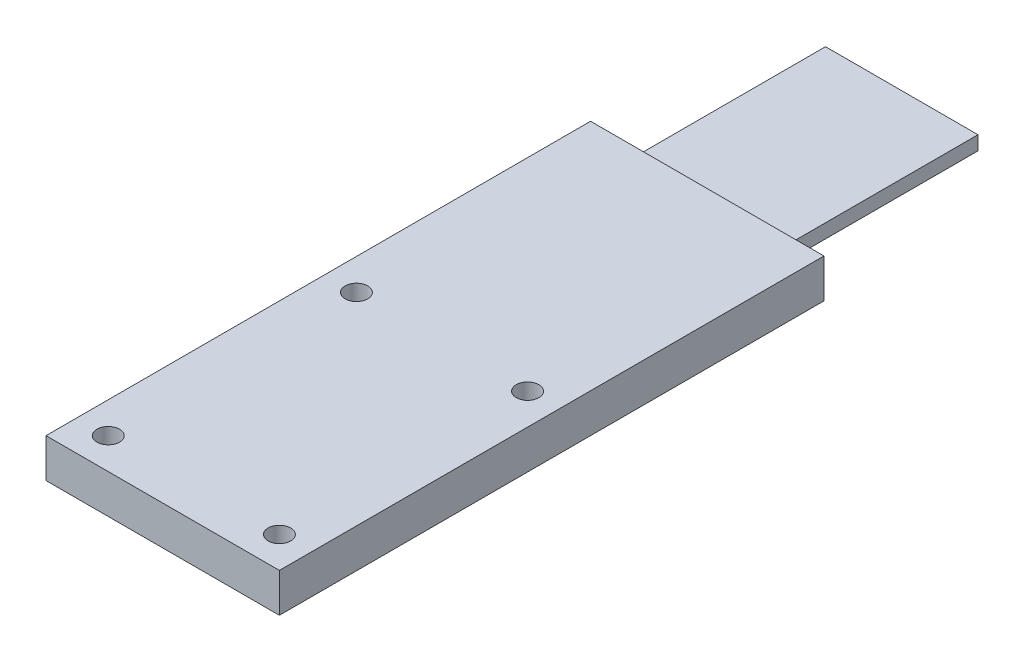
ISO-10303-21;
HEADER;
FILE_DESCRIPTION(('STEP AP214'),'2;1');
FILE_NAME('part.step','',(''),(''),'','','');
FILE_SCHEMA(('AUTOMOTIVE_DESIGN { 1 0 10303 214 1 1 1 1 }'));
ENDSEC;
DATA;
#1=APPLICATION_CONTEXT('core data for automotive mechanical design processes');
#2=APPLICATION_PROTOCOL_DEFINITION('international standard','automotive_design',2000,#1);
#3=PRODUCT_CONTEXT('',#1,'mechanical');
#4=PRODUCT('Part','Part','',(#3));
#5=PRODUCT_RELATED_PRODUCT_CATEGORY('part','',(#4));
#6=PRODUCT_DEFINITION_FORMATION('','',#4);
#7=PRODUCT_DEFINITION_CONTEXT('part definition',#1,'design');
#8=PRODUCT_DEFINITION('design','',#6,#7);
#9=PRODUCT_DEFINITION_SHAPE('','',#8);
#10=(LENGTH_UNIT() NAMED_UNIT(*) SI_UNIT(.MILLI.,.METRE.));
#11=(NAMED_UNIT(*) PLANE_ANGLE_UNIT() SI_UNIT($,.RADIAN.));
#12=(NAMED_UNIT(*) SI_UNIT($,.STERADIAN.) SOLID_ANGLE_UNIT());
#13=UNCERTAINTY_MEASURE_WITH_UNIT(LENGTH_MEASURE(1.E-05),#10,'distance_accuracy_value','');
#14=(GEOMETRIC_REPRESENTATION_CONTEXT(3) GLOBAL_UNCERTAINTY_ASSIGNED_CONTEXT((#13)) GLOBAL_UNIT_ASSIGNED_CONTEXT((#10,
#11,#12)) REPRESENTATION_CONTEXT('',''));
#15=CARTESIAN_POINT('',(0.,0.,0.));
#16=DIRECTION('',(0.,0.,1.));
#17=DIRECTION('',(1.,0.,0.));
#18=AXIS2_PLACEMENT_3D('',#15,#16,#17);
#19=CARTESIAN_POINT('',(0.,0.,0.));
#20=DIRECTION('',(0.,0.,1.));
#21=DIRECTION('',(1.,0.,0.));
#22=AXIS2_PLACEMENT_3D('',#19,#20,#21);
#23=PLANE('',#22);
#24=DIRECTION('',(0.,1.,0.));
#25=VECTOR('',#24,1.);
#26=CARTESIAN_POINT('',(0.,0.,0.));
#27=LINE('',#26,#25);
#28=CARTESIAN_POINT('',(0.,0.,0.));
#29=VERTEX_POINT('',#28);
#30=CARTESIAN_POINT('',(0.,5.00000000000001,0.));
#31=VERTEX_POINT('',#30);
#32=EDGE_CURVE('E151',#29,#31,#27,.T.);
#33=ORIENTED_EDGE('',*,*,#32,.F.);
#34=DIRECTION('',(1.,0.,0.));
#35=VECTOR('',#34,1.);
#36=CARTESIAN_POINT('',(0.,0.,0.));
#37=LINE('',#36,#35);
#38=CARTESIAN_POINT('',(-30.,0.,0.));
#39=VERTEX_POINT('',#38);
#40=EDGE_CURVE('E144',#39,#29,#37,.T.);
#41=ORIENTED_EDGE('',*,*,#40,.F.);
#42=DIRECTION('',(0.,-1.,0.));
#43=VECTOR('',#42,1.);
#44=CARTESIAN_POINT('',(-30.,0.,0.));
#45=LINE('',#44,#43);
#46=CARTESIAN_POINT('',(-30.,5.,0.));
#47=VERTEX_POINT('',#46);
#48=EDGE_CURVE('E156',#47,#39,#45,.T.);
#49=ORIENTED_EDGE('',*,*,#48,.F.);
#50=DIRECTION('',(-1.,0.,0.));
#51=VECTOR('',#50,1.);
#52=CARTESIAN_POINT('',(0.,5.00000000000001,0.));
#53=LINE('',#52,#51);
#54=EDGE_CURVE('E154',#31,#47,#53,.T.);
#55=ORIENTED_EDGE('',*,*,#54,.F.);
#56=EDGE_LOOP('',(#33,#41,#49,#55));
#57=FACE_BOUND('',#56,.T.);
#58=DIRECTION('',(0.,-1.,0.));
#59=VECTOR('',#58,1.);
#60=CARTESIAN_POINT('',(-5.2,3.40000000000001,0.));
#61=LINE('',#60,#59);
#62=CARTESIAN_POINT('',(-5.2,3.40000000000001,0.));
#63=VERTEX_POINT('',#62);
#64=CARTESIAN_POINT('',(-5.2,1.6,0.));
#65=VERTEX_POINT('',#64);
#66=EDGE_CURVE('E52',#63,#65,#61,.T.);
#67=ORIENTED_EDGE('',*,*,#66,.F.);
#68=DIRECTION('',(1.,0.,0.));
#69=VECTOR('',#68,1.);
#70=CARTESIAN_POINT('',(-5.2,3.40000000000001,0.));
#71=LINE('',#70,#69);
#72=CARTESIAN_POINT('',(-24.8,3.40000000000001,0.));
#73=VERTEX_POINT('',#72);
#74=EDGE_CURVE('E56',#73,#63,#71,.T.);
#75=ORIENTED_EDGE('',*,*,#74,.F.);
#76=DIRECTION('',(0.,1.,0.));
#77=VECTOR('',#76,1.);
#78=CARTESIAN_POINT('',(-24.8,3.40000000000001,0.));
#79=LINE('',#78,#77);
#80=CARTESIAN_POINT('',(-24.8,1.6,0.));
#81=VERTEX_POINT('',#80);
#82=EDGE_CURVE('E343',#81,#73,#79,.T.);
#83=ORIENTED_EDGE('',*,*,#82,.F.);
#84=DIRECTION('',(-1.,0.,0.));
#85=VECTOR('',#84,1.);
#86=CARTESIAN_POINT('',(-5.2,1.6,0.));
#87=LINE('',#86,#85);
#88=EDGE_CURVE('E349',#65,#81,#87,.T.);
#89=ORIENTED_EDGE('',*,*,#88,.F.);
#90=EDGE_LOOP('',(#67,#75,#83,#89));
#91=FACE_BOUND('',#90,.T.);
#92=ADVANCED_FACE('F35',(#57,#91),#23,.F.);
#93=CARTESIAN_POINT('',(0.,0.,70.));
#94=DIRECTION('',(-1.,0.,0.));
#95=DIRECTION('',(0.,-1.,0.));
#96=AXIS2_PLACEMENT_3D('',#93,#94,#95);
#97=PLANE('',#96);
#98=ORIENTED_EDGE('',*,*,#32,.T.);
#99=DIRECTION('',(0.,0.,-1.));
#100=VECTOR('',#99,1.);
#101=CARTESIAN_POINT('',(0.,5.00000000000001,70.));
#102=LINE('',#101,#100);
#103=CARTESIAN_POINT('',(0.,5.00000000000001,70.));
#104=VERTEX_POINT('',#103);
#105=EDGE_CURVE('E11',#104,#31,#102,.T.);
#106=ORIENTED_EDGE('',*,*,#105,.F.);
#107=DIRECTION('',(0.,1.,0.));
#108=VECTOR('',#107,1.);
#109=CARTESIAN_POINT('',(0.,0.,70.));
#110=LINE('',#109,#108);
#111=CARTESIAN_POINT('',(0.,0.,70.));
#112=VERTEX_POINT('',#111);
#113=EDGE_CURVE('E140',#112,#104,#110,.T.);
#114=ORIENTED_EDGE('',*,*,#113,.F.);
#115=DIRECTION('',(0.,0.,-1.));
#116=VECTOR('',#115,1.);
#117=CARTESIAN_POINT('',(0.,0.,70.));
#118=LINE('',#117,#116);
#119=EDGE_CURVE('E150',#112,#29,#118,.T.);
#120=ORIENTED_EDGE('',*,*,#119,.T.);
#121=EDGE_LOOP('',(#98,#106,#114,#120));
#122=FACE_BOUND('',#121,.T.);
#123=ADVANCED_FACE('F37',(#122),#97,.F.);
#124=CARTESIAN_POINT('',(0.,5.00000000000001,70.));
#125=DIRECTION('',(0.,-1.,0.));
#126=DIRECTION('',(1.,0.,0.));
#127=AXIS2_PLACEMENT_3D('',#124,#125,#126);
#128=PLANE('',#127);
#129=CARTESIAN_POINT('',(-26.,5.,34.1));
#130=DIRECTION('',(0.,1.,0.));
#131=DIRECTION('',(-1.,0.,0.));
#132=AXIS2_PLACEMENT_3D('',#129,#130,#131);
#133=CIRCLE('',#132,1.45);
#134=CARTESIAN_POINT('',(-27.45,5.,34.1));
#135=VERTEX_POINT('',#134);
#136=EDGE_CURVE('E131',#135,#135,#133,.T.);
#137=ORIENTED_EDGE('',*,*,#136,.F.);
#138=EDGE_LOOP('',(#137));
#139=FACE_BOUND('',#138,.T.);
#140=CARTESIAN_POINT('',(-4.00000000000001,5.,66.));
#141=DIRECTION('',(0.,1.,0.));
#142=DIRECTION('',(1.,0.,0.));
#143=AXIS2_PLACEMENT_3D('',#140,#141,#142);
#144=CIRCLE('',#143,1.45);
#145=CARTESIAN_POINT('',(-2.55000000000001,5.,66.));
#146=VERTEX_POINT('',#145);
#147=EDGE_CURVE('E125',#146,#146,#144,.T.);
#148=ORIENTED_EDGE('',*,*,#147,.F.);
#149=EDGE_LOOP('',(#148));
#150=FACE_BOUND('',#149,.T.);
#151=CARTESIAN_POINT('',(-4.,5.,34.1));
#152=DIRECTION('',(0.,1.,0.));
#153=DIRECTION('',(1.,0.,0.));
#154=AXIS2_PLACEMENT_3D('',#151,#152,#153);
#155=CIRCLE('',#154,1.45);
#156=CARTESIAN_POINT('',(-2.55,5.,34.1));
#157=VERTEX_POINT('',#156);
#158=EDGE_CURVE('E122',#157,#157,#155,.T.);
#159=ORIENTED_EDGE('',*,*,#158,.F.);
#160=EDGE_LOOP('',(#159));
#161=FACE_BOUND('',#160,.T.);
#162=CARTESIAN_POINT('',(-26.,5.,66.));
#163=DIRECTION('',(0.,1.,0.));
#164=DIRECTION('',(-1.,0.,0.));
#165=AXIS2_PLACEMENT_3D('',#162,#163,#164);
#166=CIRCLE('',#165,1.45);
#167=CARTESIAN_POINT('',(-27.45,5.,66.));
#168=VERTEX_POINT('',#167);
#169=EDGE_CURVE('E134',#168,#168,#166,.T.);
#170=ORIENTED_EDGE('',*,*,#169,.F.);
#171=EDGE_LOOP('',(#170));
#172=FACE_BOUND('',#171,.T.);
#173=ORIENTED_EDGE('',*,*,#54,.T.);
#174=DIRECTION('',(0.,0.,-1.));
#175=VECTOR('',#174,1.);
#176=CARTESIAN_POINT('',(-30.,5.,70.));
#177=LINE('',#176,#175);
#178=CARTESIAN_POINT('',(-30.,5.,70.));
#179=VERTEX_POINT('',#178);
#180=EDGE_CURVE('E44',#179,#47,#177,.T.);
#181=ORIENTED_EDGE('',*,*,#180,.F.);
#182=DIRECTION('',(-1.,0.,0.));
#183=VECTOR('',#182,1.);
#184=CARTESIAN_POINT('',(0.,5.00000000000001,70.));
#185=LINE('',#184,#183);
#186=EDGE_CURVE('E143',#104,#179,#185,.T.);
#187=ORIENTED_EDGE('',*,*,#186,.F.);
#188=ORIENTED_EDGE('',*,*,#105,.T.);
#189=EDGE_LOOP('',(#173,#181,#187,#188));
#190=FACE_BOUND('',#189,.T.);
#191=ADVANCED_FACE('F199',(#139,#150,#161,#172,#190),#128,.F.);
#192=CARTESIAN_POINT('',(-30.,0.,70.));
#193=DIRECTION('',(1.,0.,0.));
#194=DIRECTION('',(0.,0.,-1.));
#195=AXIS2_PLACEMENT_3D('',#192,#193,#194);
#196=PLANE('',#195);
#197=ORIENTED_EDGE('',*,*,#48,.T.);
#198=DIRECTION('',(0.,0.,-1.));
#199=VECTOR('',#198,1.);
#200=CARTESIAN_POINT('',(-30.,0.,70.));
#201=LINE('',#200,#199);
#202=CARTESIAN_POINT('',(-30.,0.,70.));
#203=VERTEX_POINT('',#202);
#204=EDGE_CURVE('E161',#203,#39,#201,.T.);
#205=ORIENTED_EDGE('',*,*,#204,.F.);
#206=DIRECTION('',(0.,-1.,0.));
#207=VECTOR('',#206,1.);
#208=CARTESIAN_POINT('',(-30.,0.,70.));
#209=LINE('',#208,#207);
#210=EDGE_CURVE('E146',#179,#203,#209,.T.);
#211=ORIENTED_EDGE('',*,*,#210,.F.);
#212=ORIENTED_EDGE('',*,*,#180,.T.);
#213=EDGE_LOOP('',(#197,#205,#211,#212));
#214=FACE_BOUND('',#213,.T.);
#215=ADVANCED_FACE('F208',(#214),#196,.F.);
#216=CARTESIAN_POINT('',(0.,0.,70.));
#217=DIRECTION('',(0.,1.,0.));
#218=DIRECTION('',(0.,0.,1.));
#219=AXIS2_PLACEMENT_3D('',#216,#217,#218);
#220=PLANE('',#219);
#221=CARTESIAN_POINT('',(-26.,0.,34.1));
#222=DIRECTION('',(0.,1.,0.));
#223=DIRECTION('',(0.,0.,1.));
#224=AXIS2_PLACEMENT_3D('',#221,#222,#223);
#225=CIRCLE('',#224,1.45);
#226=CARTESIAN_POINT('',(-26.,0.,35.55));
#227=VERTEX_POINT('',#226);
#228=EDGE_CURVE('E39',#227,#227,#225,.T.);
#229=ORIENTED_EDGE('',*,*,#228,.T.);
#230=EDGE_LOOP('',(#229));
#231=FACE_BOUND('',#230,.T.);
#232=CARTESIAN_POINT('',(-4.00000000000001,0.,66.));
#233=DIRECTION('',(0.,1.,0.));
#234=DIRECTION('',(0.,0.,1.));
#235=AXIS2_PLACEMENT_3D('',#232,#233,#234);
#236=CIRCLE('',#235,1.45);
#237=CARTESIAN_POINT('',(-4.00000000000001,0.,67.45));
#238=VERTEX_POINT('',#237);
#239=EDGE_CURVE('E170',#238,#238,#236,.T.);
#240=ORIENTED_EDGE('',*,*,#239,.T.);
#241=EDGE_LOOP('',(#240));
#242=FACE_BOUND('',#241,.T.);
#243=CARTESIAN_POINT('',(-4.,0.,34.1));
#244=DIRECTION('',(0.,1.,0.));
#245=DIRECTION('',(0.,0.,1.));
#246=AXIS2_PLACEMENT_3D('',#243,#244,#245);
#247=CIRCLE('',#246,1.45);
#248=CARTESIAN_POINT('',(-4.,0.,35.55));
#249=VERTEX_POINT('',#248);
#250=EDGE_CURVE('E168',#249,#249,#247,.T.);
#251=ORIENTED_EDGE('',*,*,#250,.T.);
#252=EDGE_LOOP('',(#251));
#253=FACE_BOUND('',#252,.T.);
#254=CARTESIAN_POINT('',(-26.,0.,66.));
#255=DIRECTION('',(0.,1.,0.));
#256=DIRECTION('',(0.,0.,1.));
#257=AXIS2_PLACEMENT_3D('',#254,#255,#256);
#258=CIRCLE('',#257,1.45);
#259=CARTESIAN_POINT('',(-26.,0.,67.45));
#260=VERTEX_POINT('',#259);
#261=EDGE_CURVE('E139',#260,#260,#258,.T.);
#262=ORIENTED_EDGE('',*,*,#261,.T.);
#263=EDGE_LOOP('',(#262));
#264=FACE_BOUND('',#263,.T.);
#265=ORIENTED_EDGE('',*,*,#40,.T.);
#266=ORIENTED_EDGE('',*,*,#119,.F.);
#267=DIRECTION('',(1.,0.,0.));
#268=VECTOR('',#267,1.);
#269=CARTESIAN_POINT('',(0.,0.,70.));
#270=LINE('',#269,#268);
#271=EDGE_CURVE('E148',#203,#112,#270,.T.);
#272=ORIENTED_EDGE('',*,*,#271,.F.);
#273=ORIENTED_EDGE('',*,*,#204,.T.);
#274=EDGE_LOOP('',(#265,#266,#272,#273));
#275=FACE_BOUND('',#274,.T.);
#276=ADVANCED_FACE('F177',(#231,#242,#253,#264,#275),#220,.F.);
#277=CARTESIAN_POINT('',(0.,0.,70.));
#278=DIRECTION('',(0.,0.,1.));
#279=DIRECTION('',(1.,0.,0.));
#280=AXIS2_PLACEMENT_3D('',#277,#278,#279);
#281=PLANE('',#280);
#282=ORIENTED_EDGE('',*,*,#113,.T.);
#283=ORIENTED_EDGE('',*,*,#186,.T.);
#284=ORIENTED_EDGE('',*,*,#210,.T.);
#285=ORIENTED_EDGE('',*,*,#271,.T.);
#286=EDGE_LOOP('',(#282,#283,#284,#285));
#287=FACE_BOUND('',#286,.T.);
#288=ADVANCED_FACE('F204',(#287),#281,.T.);
#289=CARTESIAN_POINT('',(-26.,-55.,66.));
#290=DIRECTION('',(0.,1.,0.));
#291=DIRECTION('',(-1.,0.,0.));
#292=AXIS2_PLACEMENT_3D('',#289,#290,#291);
#293=CYLINDRICAL_SURFACE('',#292,1.45);
#294=ORIENTED_EDGE('',*,*,#169,.T.);
#295=EDGE_LOOP('',(#294));
#296=FACE_BOUND('',#295,.T.);
#297=ORIENTED_EDGE('',*,*,#261,.F.);
#298=EDGE_LOOP('',(#297));
#299=FACE_BOUND('',#298,.T.);
#300=ADVANCED_FACE('F235',(#296,#299),#293,.F.);
#301=CARTESIAN_POINT('',(-3.99999999999999,-55.,34.1));
#302=DIRECTION('',(0.,1.,0.));
#303=DIRECTION('',(-1.,0.,0.));
#304=AXIS2_PLACEMENT_3D('',#301,#302,#303);
#305=CYLINDRICAL_SURFACE('',#304,1.45);
#306=ORIENTED_EDGE('',*,*,#158,.T.);
#307=EDGE_LOOP('',(#306));
#308=FACE_BOUND('',#307,.T.);
#309=ORIENTED_EDGE('',*,*,#250,.F.);
#310=EDGE_LOOP('',(#309));
#311=FACE_BOUND('',#310,.T.);
#312=ADVANCED_FACE('F189',(#308,#311),#305,.F.);
#313=CARTESIAN_POINT('',(-3.99999999999999,-55.,66.));
#314=DIRECTION('',(0.,1.,0.));
#315=DIRECTION('',(-1.,0.,0.));
#316=AXIS2_PLACEMENT_3D('',#313,#314,#315);
#317=CYLINDRICAL_SURFACE('',#316,1.45);
#318=ORIENTED_EDGE('',*,*,#147,.T.);
#319=EDGE_LOOP('',(#318));
#320=FACE_BOUND('',#319,.T.);
#321=ORIENTED_EDGE('',*,*,#239,.F.);
#322=EDGE_LOOP('',(#321));
#323=FACE_BOUND('',#322,.T.);
#324=ADVANCED_FACE('F181',(#320,#323),#317,.F.);
#325=CARTESIAN_POINT('',(-26.,-55.,34.1));
#326=DIRECTION('',(0.,1.,0.));
#327=DIRECTION('',(-1.,0.,0.));
#328=AXIS2_PLACEMENT_3D('',#325,#326,#327);
#329=CYLINDRICAL_SURFACE('',#328,1.45);
#330=ORIENTED_EDGE('',*,*,#136,.T.);
#331=EDGE_LOOP('',(#330));
#332=FACE_BOUND('',#331,.T.);
#333=ORIENTED_EDGE('',*,*,#228,.F.);
#334=EDGE_LOOP('',(#333));
#335=FACE_BOUND('',#334,.T.);
#336=ADVANCED_FACE('F179',(#332,#335),#329,.F.);
#337=CARTESIAN_POINT('',(-5.2,3.40000000000001,-25.));
#338=DIRECTION('',(-1.,0.,0.));
#339=DIRECTION('',(0.,0.,1.));
#340=AXIS2_PLACEMENT_3D('',#337,#338,#339);
#341=PLANE('',#340);
#342=ORIENTED_EDGE('',*,*,#66,.T.);
#343=DIRECTION('',(0.,0.,1.));
#344=VECTOR('',#343,1.);
#345=CARTESIAN_POINT('',(-5.2,1.6,-25.));
#346=LINE('',#345,#344);
#347=CARTESIAN_POINT('',(-5.2,1.6,-25.));
#348=VERTEX_POINT('',#347);
#349=EDGE_CURVE('E105',#348,#65,#346,.T.);
#350=ORIENTED_EDGE('',*,*,#349,.F.);
#351=DIRECTION('',(0.,-1.,0.));
#352=VECTOR('',#351,1.);
#353=CARTESIAN_POINT('',(-5.2,3.40000000000001,-25.));
#354=LINE('',#353,#352);
#355=CARTESIAN_POINT('',(-5.2,3.40000000000001,-25.));
#356=VERTEX_POINT('',#355);
#357=EDGE_CURVE('E111',#356,#348,#354,.T.);
#358=ORIENTED_EDGE('',*,*,#357,.F.);
#359=DIRECTION('',(0.,0.,1.));
#360=VECTOR('',#359,1.);
#361=CARTESIAN_POINT('',(-5.2,3.40000000000001,-25.));
#362=LINE('',#361,#360);
#363=EDGE_CURVE('E341',#356,#63,#362,.T.);
#364=ORIENTED_EDGE('',*,*,#363,.T.);
#365=EDGE_LOOP('',(#342,#350,#358,#364));
#366=FACE_BOUND('',#365,.T.);
#367=ADVANCED_FACE('F121',(#366),#341,.F.);
#368=CARTESIAN_POINT('',(-5.2,1.6,-25.));
#369=DIRECTION('',(0.,1.,0.));
#370=DIRECTION('',(0.,0.,1.));
#371=AXIS2_PLACEMENT_3D('',#368,#369,#370);
#372=PLANE('',#371);
#373=ORIENTED_EDGE('',*,*,#88,.T.);
#374=DIRECTION('',(0.,0.,1.));
#375=VECTOR('',#374,1.);
#376=CARTESIAN_POINT('',(-24.8,1.6,-25.));
#377=LINE('',#376,#375);
#378=CARTESIAN_POINT('',(-24.8,1.6,-25.));
#379=VERTEX_POINT('',#378);
#380=EDGE_CURVE('E107',#379,#81,#377,.T.);
#381=ORIENTED_EDGE('',*,*,#380,.F.);
#382=DIRECTION('',(-1.,0.,0.));
#383=VECTOR('',#382,1.);
#384=CARTESIAN_POINT('',(-5.2,1.6,-25.));
#385=LINE('',#384,#383);
#386=EDGE_CURVE('E100',#348,#379,#385,.T.);
#387=ORIENTED_EDGE('',*,*,#386,.F.);
#388=ORIENTED_EDGE('',*,*,#349,.T.);
#389=EDGE_LOOP('',(#373,#381,#387,#388));
#390=FACE_BOUND('',#389,.T.);
#391=ADVANCED_FACE('F103',(#390),#372,.F.);
#392=CARTESIAN_POINT('',(-24.8,3.40000000000001,-25.));
#393=DIRECTION('',(1.,0.,0.));
#394=DIRECTION('',(0.,0.,-1.));
#395=AXIS2_PLACEMENT_3D('',#392,#393,#394);
#396=PLANE('',#395);
#397=ORIENTED_EDGE('',*,*,#82,.T.);
#398=DIRECTION('',(0.,0.,1.));
#399=VECTOR('',#398,1.);
#400=CARTESIAN_POINT('',(-24.8,3.40000000000001,-25.));
#401=LINE('',#400,#399);
#402=CARTESIAN_POINT('',(-24.8,3.40000000000001,-25.));
#403=VERTEX_POINT('',#402);
#404=EDGE_CURVE('E127',#403,#73,#401,.T.);
#405=ORIENTED_EDGE('',*,*,#404,.F.);
#406=DIRECTION('',(0.,1.,0.));
#407=VECTOR('',#406,1.);
#408=CARTESIAN_POINT('',(-24.8,3.40000000000001,-25.));
#409=LINE('',#408,#407);
#410=EDGE_CURVE('E110',#379,#403,#409,.T.);
#411=ORIENTED_EDGE('',*,*,#410,.F.);
#412=ORIENTED_EDGE('',*,*,#380,.T.);
#413=EDGE_LOOP('',(#397,#405,#411,#412));
#414=FACE_BOUND('',#413,.T.);
#415=ADVANCED_FACE('F253',(#414),#396,.F.);
#416=CARTESIAN_POINT('',(-5.2,3.40000000000001,-25.));
#417=DIRECTION('',(0.,-1.,0.));
#418=DIRECTION('',(0.,0.,-1.));
#419=AXIS2_PLACEMENT_3D('',#416,#417,#418);
#420=PLANE('',#419);
#421=ORIENTED_EDGE('',*,*,#74,.T.);
#422=ORIENTED_EDGE('',*,*,#363,.F.);
#423=DIRECTION('',(1.,0.,0.));
#424=VECTOR('',#423,1.);
#425=CARTESIAN_POINT('',(-5.2,3.40000000000001,-25.));
#426=LINE('',#425,#424);
#427=EDGE_CURVE('E116',#403,#356,#426,.T.);
#428=ORIENTED_EDGE('',*,*,#427,.F.);
#429=ORIENTED_EDGE('',*,*,#404,.T.);
#430=EDGE_LOOP('',(#421,#422,#428,#429));
#431=FACE_BOUND('',#430,.T.);
#432=ADVANCED_FACE('F256',(#431),#420,.F.);
#433=CARTESIAN_POINT('',(0.,0.,-25.));
#434=DIRECTION('',(0.,0.,-1.));
#435=DIRECTION('',(-1.,0.,0.));
#436=AXIS2_PLACEMENT_3D('',#433,#434,#435);
#437=PLANE('',#436);
#438=ORIENTED_EDGE('',*,*,#357,.T.);
#439=ORIENTED_EDGE('',*,*,#386,.T.);
#440=ORIENTED_EDGE('',*,*,#410,.T.);
#441=ORIENTED_EDGE('',*,*,#427,.T.);
#442=EDGE_LOOP('',(#438,#439,#440,#441));
#443=FACE_BOUND('',#442,.T.);
#444=ADVANCED_FACE('F114',(#443),#437,.T.);
#445=CLOSED_SHELL('',(#92,#123,#191,#215,#276,#288,#300,#312,#324,#336,#367,#391,#415,#432,#444));
#446=MANIFOLD_SOLID_BREP('B2',#445);
#447=ADVANCED_BREP_SHAPE_REPRESENTATION('',(#18,#446),#14);
#448=SHAPE_DEFINITION_REPRESENTATION(#9,#447);
ENDSEC;
END-ISO-10303-21;
